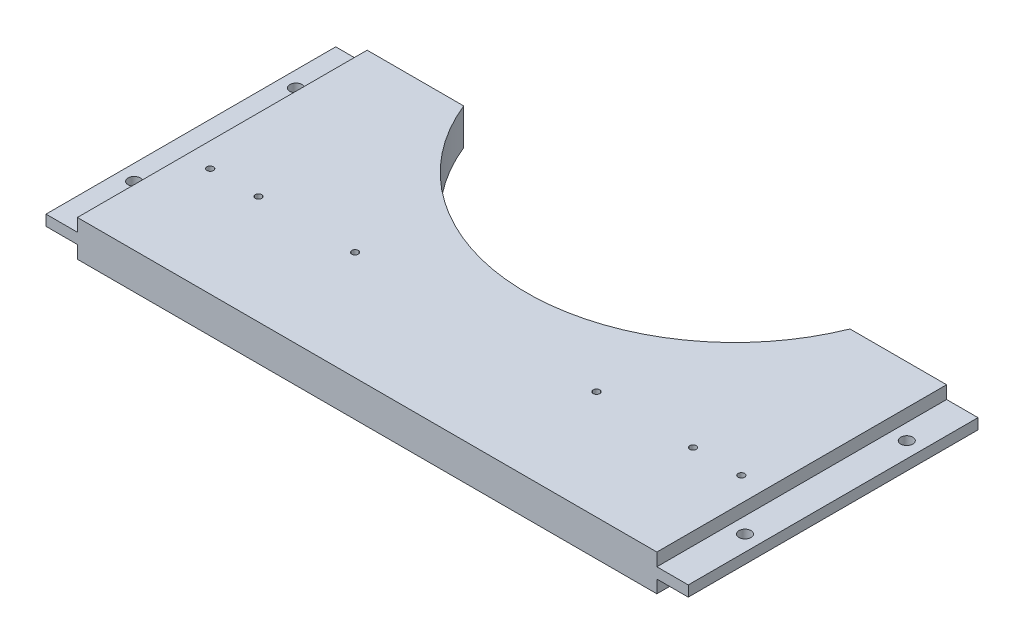
ISO-10303-21;
HEADER;
FILE_DESCRIPTION(('STEP AP214'),'2;1');
FILE_NAME('part.step','',(''),(''),'','','');
FILE_SCHEMA(('AUTOMOTIVE_DESIGN { 1 0 10303 214 1 1 1 1 }'));
ENDSEC;
DATA;
#1=APPLICATION_CONTEXT('core data for automotive mechanical design processes');
#2=APPLICATION_PROTOCOL_DEFINITION('international standard','automotive_design',2000,#1);
#3=PRODUCT_CONTEXT('',#1,'mechanical');
#4=PRODUCT('Part','Part','',(#3));
#5=PRODUCT_RELATED_PRODUCT_CATEGORY('part','',(#4));
#6=PRODUCT_DEFINITION_FORMATION('','',#4);
#7=PRODUCT_DEFINITION_CONTEXT('part definition',#1,'design');
#8=PRODUCT_DEFINITION('design','',#6,#7);
#9=PRODUCT_DEFINITION_SHAPE('','',#8);
#10=(LENGTH_UNIT() NAMED_UNIT(*) SI_UNIT(.MILLI.,.METRE.));
#11=(NAMED_UNIT(*) PLANE_ANGLE_UNIT() SI_UNIT($,.RADIAN.));
#12=(NAMED_UNIT(*) SI_UNIT($,.STERADIAN.) SOLID_ANGLE_UNIT());
#13=UNCERTAINTY_MEASURE_WITH_UNIT(LENGTH_MEASURE(1.E-05),#10,'distance_accuracy_value','');
#14=(GEOMETRIC_REPRESENTATION_CONTEXT(3) GLOBAL_UNCERTAINTY_ASSIGNED_CONTEXT((#13)) GLOBAL_UNIT_ASSIGNED_CONTEXT((#10,
#11,#12)) REPRESENTATION_CONTEXT('',''));
#15=CARTESIAN_POINT('',(0.,0.,0.));
#16=DIRECTION('',(0.,0.,1.));
#17=DIRECTION('',(1.,0.,0.));
#18=AXIS2_PLACEMENT_3D('',#15,#16,#17);
#19=CARTESIAN_POINT('',(152.4,9.525,0.));
#20=DIRECTION('',(-1.,0.,0.));
#21=DIRECTION('',(0.,0.,1.));
#22=AXIS2_PLACEMENT_3D('',#19,#20,#21);
#23=PLANE('',#22);
#24=DIRECTION('',(0.,0.,-1.));
#25=VECTOR('',#24,1.);
#26=CARTESIAN_POINT('',(152.4,-2.794,-76.2));
#27=LINE('',#26,#25);
#28=CARTESIAN_POINT('',(152.4,-2.794,76.2));
#29=VERTEX_POINT('',#28);
#30=CARTESIAN_POINT('',(152.4,-2.794,-76.2));
#31=VERTEX_POINT('',#30);
#32=EDGE_CURVE('E192',#29,#31,#27,.T.);
#33=ORIENTED_EDGE('',*,*,#32,.F.);
#34=DIRECTION('',(0.,-1.,0.));
#35=VECTOR('',#34,1.);
#36=CARTESIAN_POINT('',(152.4,9.525,76.2));
#37=LINE('',#36,#35);
#38=CARTESIAN_POINT('',(152.4,-9.525,76.2));
#39=VERTEX_POINT('',#38);
#40=EDGE_CURVE('E172',#29,#39,#37,.T.);
#41=ORIENTED_EDGE('',*,*,#40,.T.);
#42=DIRECTION('',(0.,0.,-1.));
#43=VECTOR('',#42,1.);
#44=CARTESIAN_POINT('',(152.4,-9.525,0.));
#45=LINE('',#44,#43);
#46=CARTESIAN_POINT('',(152.4,-9.525,-76.2));
#47=VERTEX_POINT('',#46);
#48=EDGE_CURVE('E343',#39,#47,#45,.T.);
#49=ORIENTED_EDGE('',*,*,#48,.T.);
#50=DIRECTION('',(0.,-1.,0.));
#51=VECTOR('',#50,1.);
#52=CARTESIAN_POINT('',(152.4,9.525,-76.2));
#53=LINE('',#52,#51);
#54=EDGE_CURVE('E365',#31,#47,#53,.T.);
#55=ORIENTED_EDGE('',*,*,#54,.F.);
#56=EDGE_LOOP('',(#33,#41,#49,#55));
#57=FACE_BOUND('',#56,.T.);
#58=ADVANCED_FACE('F43',(#57),#23,.F.);
#59=CARTESIAN_POINT('',(-152.4,9.525,0.));
#60=DIRECTION('',(1.,0.,0.));
#61=DIRECTION('',(0.,0.,-1.));
#62=AXIS2_PLACEMENT_3D('',#59,#60,#61);
#63=PLANE('',#62);
#64=DIRECTION('',(0.,0.,-1.));
#65=VECTOR('',#64,1.);
#66=CARTESIAN_POINT('',(-152.4,2.794,-76.2));
#67=LINE('',#66,#65);
#68=CARTESIAN_POINT('',(-152.4,2.794,76.2));
#69=VERTEX_POINT('',#68);
#70=CARTESIAN_POINT('',(-152.4,2.794,-76.2));
#71=VERTEX_POINT('',#70);
#72=EDGE_CURVE('E233',#69,#71,#67,.T.);
#73=ORIENTED_EDGE('',*,*,#72,.F.);
#74=DIRECTION('',(0.,-1.,0.));
#75=VECTOR('',#74,1.);
#76=CARTESIAN_POINT('',(-152.4,9.525,76.2));
#77=LINE('',#76,#75);
#78=CARTESIAN_POINT('',(-152.4,9.525,76.2));
#79=VERTEX_POINT('',#78);
#80=EDGE_CURVE('E11',#79,#69,#77,.T.);
#81=ORIENTED_EDGE('',*,*,#80,.F.);
#82=DIRECTION('',(0.,0.,1.));
#83=VECTOR('',#82,1.);
#84=CARTESIAN_POINT('',(-152.4,9.525,0.));
#85=LINE('',#84,#83);
#86=CARTESIAN_POINT('',(-152.4,9.525,-76.2));
#87=VERTEX_POINT('',#86);
#88=EDGE_CURVE('E316',#87,#79,#85,.T.);
#89=ORIENTED_EDGE('',*,*,#88,.F.);
#90=DIRECTION('',(0.,-1.,0.));
#91=VECTOR('',#90,1.);
#92=CARTESIAN_POINT('',(-152.4,9.525,-76.2));
#93=LINE('',#92,#91);
#94=EDGE_CURVE('E358',#87,#71,#93,.T.);
#95=ORIENTED_EDGE('',*,*,#94,.T.);
#96=EDGE_LOOP('',(#73,#81,#89,#95));
#97=FACE_BOUND('',#96,.T.);
#98=ADVANCED_FACE('F428',(#97),#63,.F.);
#99=CARTESIAN_POINT('',(-152.4,-2.794,76.2));
#100=VERTEX_POINT('',#99);
#101=CARTESIAN_POINT('',(-152.4,-9.525,76.2));
#102=VERTEX_POINT('',#101);
#103=EDGE_CURVE('E53',#100,#102,#77,.T.);
#104=ORIENTED_EDGE('',*,*,#103,.F.);
#105=DIRECTION('',(0.,0.,-1.));
#106=VECTOR('',#105,1.);
#107=CARTESIAN_POINT('',(-152.4,-2.794,-76.2));
#108=LINE('',#107,#106);
#109=CARTESIAN_POINT('',(-152.4,-2.794,-76.2));
#110=VERTEX_POINT('',#109);
#111=EDGE_CURVE('E69',#100,#110,#108,.T.);
#112=ORIENTED_EDGE('',*,*,#111,.T.);
#113=CARTESIAN_POINT('',(-152.4,-9.525,-76.2));
#114=VERTEX_POINT('',#113);
#115=EDGE_CURVE('E336',#110,#114,#93,.T.);
#116=ORIENTED_EDGE('',*,*,#115,.T.);
#117=DIRECTION('',(0.,0.,1.));
#118=VECTOR('',#117,1.);
#119=CARTESIAN_POINT('',(-152.4,-9.525,0.));
#120=LINE('',#119,#118);
#121=EDGE_CURVE('E315',#114,#102,#120,.T.);
#122=ORIENTED_EDGE('',*,*,#121,.T.);
#123=EDGE_LOOP('',(#104,#112,#116,#122));
#124=FACE_BOUND('',#123,.T.);
#125=ADVANCED_FACE('F45',(#124),#63,.F.);
#126=CARTESIAN_POINT('',(0.,9.525,76.2));
#127=DIRECTION('',(0.,0.,-1.));
#128=DIRECTION('',(-1.,0.,0.));
#129=AXIS2_PLACEMENT_3D('',#126,#127,#128);
#130=PLANE('',#129);
#131=DIRECTION('',(1.,0.,0.));
#132=VECTOR('',#131,1.);
#133=CARTESIAN_POINT('',(0.,-9.525,76.2));
#134=LINE('',#133,#132);
#135=EDGE_CURVE('E340',#102,#39,#134,.T.);
#136=ORIENTED_EDGE('',*,*,#135,.T.);
#137=ORIENTED_EDGE('',*,*,#40,.F.);
#138=DIRECTION('',(-1.,0.,0.));
#139=VECTOR('',#138,1.);
#140=CARTESIAN_POINT('',(152.4,-2.794,76.2));
#141=LINE('',#140,#139);
#142=CARTESIAN_POINT('',(168.91,-2.794,76.2));
#143=VERTEX_POINT('',#142);
#144=EDGE_CURVE('E198',#143,#29,#141,.T.);
#145=ORIENTED_EDGE('',*,*,#144,.F.);
#146=DIRECTION('',(0.,-1.,0.));
#147=VECTOR('',#146,1.);
#148=CARTESIAN_POINT('',(168.91,2.794,76.2));
#149=LINE('',#148,#147);
#150=CARTESIAN_POINT('',(168.91,2.794,76.2));
#151=VERTEX_POINT('',#150);
#152=EDGE_CURVE('E165',#151,#143,#149,.T.);
#153=ORIENTED_EDGE('',*,*,#152,.F.);
#154=DIRECTION('',(-1.,0.,0.));
#155=VECTOR('',#154,1.);
#156=CARTESIAN_POINT('',(152.4,2.794,76.2));
#157=LINE('',#156,#155);
#158=CARTESIAN_POINT('',(152.4,2.794,76.2));
#159=VERTEX_POINT('',#158);
#160=EDGE_CURVE('E149',#151,#159,#157,.T.);
#161=ORIENTED_EDGE('',*,*,#160,.T.);
#162=CARTESIAN_POINT('',(152.4,9.525,76.2));
#163=VERTEX_POINT('',#162);
#164=EDGE_CURVE('E162',#163,#159,#37,.T.);
#165=ORIENTED_EDGE('',*,*,#164,.F.);
#166=DIRECTION('',(1.,0.,0.));
#167=VECTOR('',#166,1.);
#168=CARTESIAN_POINT('',(0.,9.525,76.2));
#169=LINE('',#168,#167);
#170=EDGE_CURVE('E320',#79,#163,#169,.T.);
#171=ORIENTED_EDGE('',*,*,#170,.F.);
#172=ORIENTED_EDGE('',*,*,#80,.T.);
#173=DIRECTION('',(1.,0.,0.));
#174=VECTOR('',#173,1.);
#175=CARTESIAN_POINT('',(-152.4,2.794,76.2));
#176=LINE('',#175,#174);
#177=CARTESIAN_POINT('',(-168.91,2.794,76.2));
#178=VERTEX_POINT('',#177);
#179=EDGE_CURVE('E244',#178,#69,#176,.T.);
#180=ORIENTED_EDGE('',*,*,#179,.F.);
#181=DIRECTION('',(0.,-1.,0.));
#182=VECTOR('',#181,1.);
#183=CARTESIAN_POINT('',(-168.91,2.794,76.2));
#184=LINE('',#183,#182);
#185=CARTESIAN_POINT('',(-168.91,-2.794,76.2));
#186=VERTEX_POINT('',#185);
#187=EDGE_CURVE('E248',#178,#186,#184,.T.);
#188=ORIENTED_EDGE('',*,*,#187,.T.);
#189=DIRECTION('',(1.,0.,0.));
#190=VECTOR('',#189,1.);
#191=CARTESIAN_POINT('',(-152.4,-2.794,76.2));
#192=LINE('',#191,#190);
#193=EDGE_CURVE('E238',#186,#100,#192,.T.);
#194=ORIENTED_EDGE('',*,*,#193,.T.);
#195=ORIENTED_EDGE('',*,*,#103,.T.);
#196=EDGE_LOOP('',(#136,#137,#145,#153,#161,#165,#171,#172,#180,#188,#194,#195));
#197=FACE_BOUND('',#196,.T.);
#198=ADVANCED_FACE('F161',(#197),#130,.F.);
#199=ORIENTED_EDGE('',*,*,#164,.T.);
#200=DIRECTION('',(0.,0.,-1.));
#201=VECTOR('',#200,1.);
#202=CARTESIAN_POINT('',(152.4,2.794,-76.2));
#203=LINE('',#202,#201);
#204=CARTESIAN_POINT('',(152.4,2.794,-76.2));
#205=VERTEX_POINT('',#204);
#206=EDGE_CURVE('E146',#159,#205,#203,.T.);
#207=ORIENTED_EDGE('',*,*,#206,.T.);
#208=CARTESIAN_POINT('',(152.4,9.525,-76.2));
#209=VERTEX_POINT('',#208);
#210=EDGE_CURVE('E176',#209,#205,#53,.T.);
#211=ORIENTED_EDGE('',*,*,#210,.F.);
#212=DIRECTION('',(0.,0.,-1.));
#213=VECTOR('',#212,1.);
#214=CARTESIAN_POINT('',(152.4,9.525,0.));
#215=LINE('',#214,#213);
#216=EDGE_CURVE('E170',#163,#209,#215,.T.);
#217=ORIENTED_EDGE('',*,*,#216,.F.);
#218=EDGE_LOOP('',(#199,#207,#211,#217));
#219=FACE_BOUND('',#218,.T.);
#220=ADVANCED_FACE('F169',(#219),#23,.F.);
#221=CARTESIAN_POINT('',(0.,9.525,-76.2));
#222=DIRECTION('',(0.,0.,1.));
#223=DIRECTION('',(1.,0.,0.));
#224=AXIS2_PLACEMENT_3D('',#221,#222,#223);
#225=PLANE('',#224);
#226=DIRECTION('',(-1.,0.,0.));
#227=VECTOR('',#226,1.);
#228=CARTESIAN_POINT('',(0.,-9.525,-76.2));
#229=LINE('',#228,#227);
#230=CARTESIAN_POINT('',(101.6,-9.525,-76.2));
#231=VERTEX_POINT('',#230);
#232=EDGE_CURVE('E347',#47,#231,#229,.T.);
#233=ORIENTED_EDGE('',*,*,#232,.T.);
#234=DIRECTION('',(0.,-1.,0.));
#235=VECTOR('',#234,1.);
#236=CARTESIAN_POINT('',(101.6,9.525,-76.2));
#237=LINE('',#236,#235);
#238=CARTESIAN_POINT('',(101.6,9.525,-76.2));
#239=VERTEX_POINT('',#238);
#240=EDGE_CURVE('E363',#239,#231,#237,.T.);
#241=ORIENTED_EDGE('',*,*,#240,.F.);
#242=DIRECTION('',(-1.,0.,0.));
#243=VECTOR('',#242,1.);
#244=CARTESIAN_POINT('',(0.,9.525,-76.2));
#245=LINE('',#244,#243);
#246=EDGE_CURVE('E326',#209,#239,#245,.T.);
#247=ORIENTED_EDGE('',*,*,#246,.F.);
#248=ORIENTED_EDGE('',*,*,#210,.T.);
#249=DIRECTION('',(1.,0.,0.));
#250=VECTOR('',#249,1.);
#251=CARTESIAN_POINT('',(152.4,2.794,-76.2));
#252=LINE('',#251,#250);
#253=CARTESIAN_POINT('',(168.91,2.794,-76.2));
#254=VERTEX_POINT('',#253);
#255=EDGE_CURVE('E61',#205,#254,#252,.T.);
#256=ORIENTED_EDGE('',*,*,#255,.T.);
#257=DIRECTION('',(0.,-1.,0.));
#258=VECTOR('',#257,1.);
#259=CARTESIAN_POINT('',(168.91,2.794,-76.2));
#260=LINE('',#259,#258);
#261=CARTESIAN_POINT('',(168.91,-2.794,-76.2));
#262=VERTEX_POINT('',#261);
#263=EDGE_CURVE('E212',#254,#262,#260,.T.);
#264=ORIENTED_EDGE('',*,*,#263,.T.);
#265=DIRECTION('',(1.,0.,0.));
#266=VECTOR('',#265,1.);
#267=CARTESIAN_POINT('',(152.4,-2.794,-76.2));
#268=LINE('',#267,#266);
#269=EDGE_CURVE('E156',#31,#262,#268,.T.);
#270=ORIENTED_EDGE('',*,*,#269,.F.);
#271=ORIENTED_EDGE('',*,*,#54,.T.);
#272=EDGE_LOOP('',(#233,#241,#247,#248,#256,#264,#270,#271));
#273=FACE_BOUND('',#272,.T.);
#274=ADVANCED_FACE('F375',(#273),#225,.F.);
#275=CARTESIAN_POINT('',(0.,9.525,-117.169259259259));
#276=DIRECTION('',(0.,-1.,0.));
#277=DIRECTION('',(0.,0.,-1.));
#278=AXIS2_PLACEMENT_3D('',#275,#276,#277);
#279=CYLINDRICAL_SURFACE('',#278,109.549259259259);
#280=CARTESIAN_POINT('',(0.,-9.525,-117.169259259259));
#281=DIRECTION('',(0.,1.,0.));
#282=DIRECTION('',(0.,0.,1.));
#283=AXIS2_PLACEMENT_3D('',#280,#281,#282);
#284=CIRCLE('',#283,109.549259259259);
#285=CARTESIAN_POINT('',(-101.6,-9.525,-76.2));
#286=VERTEX_POINT('',#285);
#287=EDGE_CURVE('E351',#286,#231,#284,.T.);
#288=ORIENTED_EDGE('',*,*,#287,.F.);
#289=DIRECTION('',(0.,-1.,0.));
#290=VECTOR('',#289,1.);
#291=CARTESIAN_POINT('',(-101.6,9.525,-76.2));
#292=LINE('',#291,#290);
#293=CARTESIAN_POINT('',(-101.6,9.525,-76.2));
#294=VERTEX_POINT('',#293);
#295=EDGE_CURVE('E361',#294,#286,#292,.T.);
#296=ORIENTED_EDGE('',*,*,#295,.F.);
#297=CARTESIAN_POINT('',(0.,9.525,-117.169259259259));
#298=DIRECTION('',(0.,1.,0.));
#299=DIRECTION('',(0.,0.,1.));
#300=AXIS2_PLACEMENT_3D('',#297,#298,#299);
#301=CIRCLE('',#300,109.549259259259);
#302=EDGE_CURVE('E329',#294,#239,#301,.T.);
#303=ORIENTED_EDGE('',*,*,#302,.T.);
#304=ORIENTED_EDGE('',*,*,#240,.T.);
#305=EDGE_LOOP('',(#288,#296,#303,#304));
#306=FACE_BOUND('',#305,.T.);
#307=ADVANCED_FACE('F441',(#306),#279,.F.);
#308=CARTESIAN_POINT('',(0.,9.525,-76.2));
#309=DIRECTION('',(0.,0.,1.));
#310=DIRECTION('',(1.,0.,0.));
#311=AXIS2_PLACEMENT_3D('',#308,#309,#310);
#312=PLANE('',#311);
#313=DIRECTION('',(-1.,0.,0.));
#314=VECTOR('',#313,1.);
#315=CARTESIAN_POINT('',(0.,-9.525,-76.2));
#316=LINE('',#315,#314);
#317=EDGE_CURVE('E321',#286,#114,#316,.T.);
#318=ORIENTED_EDGE('',*,*,#317,.T.);
#319=ORIENTED_EDGE('',*,*,#115,.F.);
#320=DIRECTION('',(-1.,0.,0.));
#321=VECTOR('',#320,1.);
#322=CARTESIAN_POINT('',(-152.4,-2.794,-76.2));
#323=LINE('',#322,#321);
#324=CARTESIAN_POINT('',(-168.91,-2.794,-76.2));
#325=VERTEX_POINT('',#324);
#326=EDGE_CURVE('E251',#110,#325,#323,.T.);
#327=ORIENTED_EDGE('',*,*,#326,.T.);
#328=DIRECTION('',(0.,-1.,0.));
#329=VECTOR('',#328,1.);
#330=CARTESIAN_POINT('',(-168.91,2.794,-76.2));
#331=LINE('',#330,#329);
#332=CARTESIAN_POINT('',(-168.91,2.794,-76.2));
#333=VERTEX_POINT('',#332);
#334=EDGE_CURVE('E263',#333,#325,#331,.T.);
#335=ORIENTED_EDGE('',*,*,#334,.F.);
#336=DIRECTION('',(-1.,0.,0.));
#337=VECTOR('',#336,1.);
#338=CARTESIAN_POINT('',(-152.4,2.794,-76.2));
#339=LINE('',#338,#337);
#340=EDGE_CURVE('E237',#71,#333,#339,.T.);
#341=ORIENTED_EDGE('',*,*,#340,.F.);
#342=ORIENTED_EDGE('',*,*,#94,.F.);
#343=DIRECTION('',(-1.,0.,0.));
#344=VECTOR('',#343,1.);
#345=CARTESIAN_POINT('',(0.,9.525,-76.2));
#346=LINE('',#345,#344);
#347=EDGE_CURVE('E333',#294,#87,#346,.T.);
#348=ORIENTED_EDGE('',*,*,#347,.F.);
#349=ORIENTED_EDGE('',*,*,#295,.T.);
#350=EDGE_LOOP('',(#318,#319,#327,#335,#341,#342,#348,#349));
#351=FACE_BOUND('',#350,.T.);
#352=ADVANCED_FACE('F397',(#351),#312,.F.);
#353=CARTESIAN_POINT('',(0.,9.525,0.));
#354=DIRECTION('',(0.,1.,0.));
#355=DIRECTION('',(0.,0.,1.));
#356=AXIS2_PLACEMENT_3D('',#353,#354,#355);
#357=PLANE('',#356);
#358=CARTESIAN_POINT('',(139.7,9.525,19.05));
#359=DIRECTION('',(0.,1.,0.));
#360=DIRECTION('',(0.,0.,1.));
#361=AXIS2_PLACEMENT_3D('',#358,#359,#360);
#362=CIRCLE('',#361,1.72719999999998);
#363=CARTESIAN_POINT('',(139.7,9.525,20.7772));
#364=VERTEX_POINT('',#363);
#365=EDGE_CURVE('E267',#364,#364,#362,.T.);
#366=ORIENTED_EDGE('',*,*,#365,.F.);
#367=EDGE_LOOP('',(#366));
#368=FACE_BOUND('',#367,.T.);
#369=CARTESIAN_POINT('',(114.3,9.525,19.05));
#370=DIRECTION('',(0.,1.,0.));
#371=DIRECTION('',(0.,0.,1.));
#372=AXIS2_PLACEMENT_3D('',#369,#370,#371);
#373=CIRCLE('',#372,1.7272);
#374=CARTESIAN_POINT('',(114.3,9.525,20.7772));
#375=VERTEX_POINT('',#374);
#376=EDGE_CURVE('E275',#375,#375,#373,.T.);
#377=ORIENTED_EDGE('',*,*,#376,.F.);
#378=EDGE_LOOP('',(#377));
#379=FACE_BOUND('',#378,.T.);
#380=CARTESIAN_POINT('',(63.5,9.525,19.05));
#381=DIRECTION('',(0.,1.,0.));
#382=DIRECTION('',(0.,0.,1.));
#383=AXIS2_PLACEMENT_3D('',#380,#381,#382);
#384=CIRCLE('',#383,1.7272);
#385=CARTESIAN_POINT('',(63.5,9.525,20.7772));
#386=VERTEX_POINT('',#385);
#387=EDGE_CURVE('E283',#386,#386,#384,.T.);
#388=ORIENTED_EDGE('',*,*,#387,.F.);
#389=EDGE_LOOP('',(#388));
#390=FACE_BOUND('',#389,.T.);
#391=CARTESIAN_POINT('',(-139.7,9.525,19.05));
#392=DIRECTION('',(0.,1.,0.));
#393=DIRECTION('',(0.,0.,1.));
#394=AXIS2_PLACEMENT_3D('',#391,#392,#393);
#395=CIRCLE('',#394,1.72719999999998);
#396=CARTESIAN_POINT('',(-139.7,9.525,20.7772));
#397=VERTEX_POINT('',#396);
#398=EDGE_CURVE('E291',#397,#397,#395,.T.);
#399=ORIENTED_EDGE('',*,*,#398,.F.);
#400=EDGE_LOOP('',(#399));
#401=FACE_BOUND('',#400,.T.);
#402=CARTESIAN_POINT('',(-114.3,9.525,19.05));
#403=DIRECTION('',(0.,1.,0.));
#404=DIRECTION('',(0.,0.,1.));
#405=AXIS2_PLACEMENT_3D('',#402,#403,#404);
#406=CIRCLE('',#405,1.7272);
#407=CARTESIAN_POINT('',(-114.3,9.525,20.7772));
#408=VERTEX_POINT('',#407);
#409=EDGE_CURVE('E299',#408,#408,#406,.T.);
#410=ORIENTED_EDGE('',*,*,#409,.F.);
#411=EDGE_LOOP('',(#410));
#412=FACE_BOUND('',#411,.T.);
#413=CARTESIAN_POINT('',(-63.5,9.525,19.05));
#414=DIRECTION('',(0.,1.,0.));
#415=DIRECTION('',(0.,0.,1.));
#416=AXIS2_PLACEMENT_3D('',#413,#414,#415);
#417=CIRCLE('',#416,1.7272);
#418=CARTESIAN_POINT('',(-63.5,9.525,20.7772));
#419=VERTEX_POINT('',#418);
#420=EDGE_CURVE('E307',#419,#419,#417,.T.);
#421=ORIENTED_EDGE('',*,*,#420,.F.);
#422=EDGE_LOOP('',(#421));
#423=FACE_BOUND('',#422,.T.);
#424=ORIENTED_EDGE('',*,*,#88,.T.);
#425=ORIENTED_EDGE('',*,*,#170,.T.);
#426=ORIENTED_EDGE('',*,*,#216,.T.);
#427=ORIENTED_EDGE('',*,*,#246,.T.);
#428=ORIENTED_EDGE('',*,*,#302,.F.);
#429=ORIENTED_EDGE('',*,*,#347,.T.);
#430=EDGE_LOOP('',(#424,#425,#426,#427,#428,#429));
#431=FACE_BOUND('',#430,.T.);
#432=ADVANCED_FACE('F378',(#368,#379,#390,#401,#412,#423,#431),#357,.T.);
#433=CARTESIAN_POINT('',(0.,-9.525,0.));
#434=DIRECTION('',(0.,1.,0.));
#435=DIRECTION('',(0.,0.,1.));
#436=AXIS2_PLACEMENT_3D('',#433,#434,#435);
#437=PLANE('',#436);
#438=CARTESIAN_POINT('',(139.7,-9.525,19.05));
#439=DIRECTION('',(0.,1.,0.));
#440=DIRECTION('',(0.,0.,1.));
#441=AXIS2_PLACEMENT_3D('',#438,#439,#440);
#442=CIRCLE('',#441,1.72719999999998);
#443=CARTESIAN_POINT('',(139.7,-9.525,20.7772));
#444=VERTEX_POINT('',#443);
#445=EDGE_CURVE('E271',#444,#444,#442,.T.);
#446=ORIENTED_EDGE('',*,*,#445,.T.);
#447=EDGE_LOOP('',(#446));
#448=FACE_BOUND('',#447,.T.);
#449=CARTESIAN_POINT('',(114.3,-9.525,19.05));
#450=DIRECTION('',(0.,1.,0.));
#451=DIRECTION('',(0.,0.,1.));
#452=AXIS2_PLACEMENT_3D('',#449,#450,#451);
#453=CIRCLE('',#452,1.7272);
#454=CARTESIAN_POINT('',(114.3,-9.525,20.7772));
#455=VERTEX_POINT('',#454);
#456=EDGE_CURVE('E279',#455,#455,#453,.T.);
#457=ORIENTED_EDGE('',*,*,#456,.T.);
#458=EDGE_LOOP('',(#457));
#459=FACE_BOUND('',#458,.T.);
#460=CARTESIAN_POINT('',(63.5,-9.525,19.05));
#461=DIRECTION('',(0.,1.,0.));
#462=DIRECTION('',(0.,0.,1.));
#463=AXIS2_PLACEMENT_3D('',#460,#461,#462);
#464=CIRCLE('',#463,1.7272);
#465=CARTESIAN_POINT('',(63.5,-9.525,20.7772));
#466=VERTEX_POINT('',#465);
#467=EDGE_CURVE('E287',#466,#466,#464,.T.);
#468=ORIENTED_EDGE('',*,*,#467,.T.);
#469=EDGE_LOOP('',(#468));
#470=FACE_BOUND('',#469,.T.);
#471=CARTESIAN_POINT('',(-139.7,-9.525,19.05));
#472=DIRECTION('',(0.,1.,0.));
#473=DIRECTION('',(0.,0.,1.));
#474=AXIS2_PLACEMENT_3D('',#471,#472,#473);
#475=CIRCLE('',#474,1.72719999999998);
#476=CARTESIAN_POINT('',(-139.7,-9.525,20.7772));
#477=VERTEX_POINT('',#476);
#478=EDGE_CURVE('E295',#477,#477,#475,.T.);
#479=ORIENTED_EDGE('',*,*,#478,.T.);
#480=EDGE_LOOP('',(#479));
#481=FACE_BOUND('',#480,.T.);
#482=CARTESIAN_POINT('',(-114.3,-9.525,19.05));
#483=DIRECTION('',(0.,1.,0.));
#484=DIRECTION('',(0.,0.,1.));
#485=AXIS2_PLACEMENT_3D('',#482,#483,#484);
#486=CIRCLE('',#485,1.7272);
#487=CARTESIAN_POINT('',(-114.3,-9.525,20.7772));
#488=VERTEX_POINT('',#487);
#489=EDGE_CURVE('E303',#488,#488,#486,.T.);
#490=ORIENTED_EDGE('',*,*,#489,.T.);
#491=EDGE_LOOP('',(#490));
#492=FACE_BOUND('',#491,.T.);
#493=CARTESIAN_POINT('',(-63.5,-9.525,19.05));
#494=DIRECTION('',(0.,1.,0.));
#495=DIRECTION('',(0.,0.,1.));
#496=AXIS2_PLACEMENT_3D('',#493,#494,#495);
#497=CIRCLE('',#496,1.7272);
#498=CARTESIAN_POINT('',(-63.5,-9.525,20.7772));
#499=VERTEX_POINT('',#498);
#500=EDGE_CURVE('E311',#499,#499,#497,.T.);
#501=ORIENTED_EDGE('',*,*,#500,.T.);
#502=EDGE_LOOP('',(#501));
#503=FACE_BOUND('',#502,.T.);
#504=ORIENTED_EDGE('',*,*,#121,.F.);
#505=ORIENTED_EDGE('',*,*,#317,.F.);
#506=ORIENTED_EDGE('',*,*,#287,.T.);
#507=ORIENTED_EDGE('',*,*,#232,.F.);
#508=ORIENTED_EDGE('',*,*,#48,.F.);
#509=ORIENTED_EDGE('',*,*,#135,.F.);
#510=EDGE_LOOP('',(#504,#505,#506,#507,#508,#509));
#511=FACE_BOUND('',#510,.T.);
#512=ADVANCED_FACE('F403',(#448,#459,#470,#481,#492,#503,#511),#437,.F.);
#513=CARTESIAN_POINT('',(-63.5,9.525,19.05));
#514=DIRECTION('',(0.,1.,0.));
#515=DIRECTION('',(0.,0.,1.));
#516=AXIS2_PLACEMENT_3D('',#513,#514,#515);
#517=CYLINDRICAL_SURFACE('',#516,1.7272);
#518=ORIENTED_EDGE('',*,*,#500,.F.);
#519=EDGE_LOOP('',(#518));
#520=FACE_BOUND('',#519,.T.);
#521=ORIENTED_EDGE('',*,*,#420,.T.);
#522=EDGE_LOOP('',(#521));
#523=FACE_BOUND('',#522,.T.);
#524=ADVANCED_FACE('F604',(#520,#523),#517,.F.);
#525=CARTESIAN_POINT('',(-114.3,9.525,19.05));
#526=DIRECTION('',(0.,1.,0.));
#527=DIRECTION('',(0.,0.,1.));
#528=AXIS2_PLACEMENT_3D('',#525,#526,#527);
#529=CYLINDRICAL_SURFACE('',#528,1.7272);
#530=ORIENTED_EDGE('',*,*,#489,.F.);
#531=EDGE_LOOP('',(#530));
#532=FACE_BOUND('',#531,.T.);
#533=ORIENTED_EDGE('',*,*,#409,.T.);
#534=EDGE_LOOP('',(#533));
#535=FACE_BOUND('',#534,.T.);
#536=ADVANCED_FACE('F621',(#532,#535),#529,.F.);
#537=CARTESIAN_POINT('',(-139.7,9.525,19.05));
#538=DIRECTION('',(0.,1.,0.));
#539=DIRECTION('',(0.,0.,1.));
#540=AXIS2_PLACEMENT_3D('',#537,#538,#539);
#541=CYLINDRICAL_SURFACE('',#540,1.72719999999998);
#542=ORIENTED_EDGE('',*,*,#478,.F.);
#543=EDGE_LOOP('',(#542));
#544=FACE_BOUND('',#543,.T.);
#545=ORIENTED_EDGE('',*,*,#398,.T.);
#546=EDGE_LOOP('',(#545));
#547=FACE_BOUND('',#546,.T.);
#548=ADVANCED_FACE('F631',(#544,#547),#541,.F.);
#549=CARTESIAN_POINT('',(63.5,9.525,19.05));
#550=DIRECTION('',(0.,1.,0.));
#551=DIRECTION('',(0.,0.,1.));
#552=AXIS2_PLACEMENT_3D('',#549,#550,#551);
#553=CYLINDRICAL_SURFACE('',#552,1.7272);
#554=ORIENTED_EDGE('',*,*,#467,.F.);
#555=EDGE_LOOP('',(#554));
#556=FACE_BOUND('',#555,.T.);
#557=ORIENTED_EDGE('',*,*,#387,.T.);
#558=EDGE_LOOP('',(#557));
#559=FACE_BOUND('',#558,.T.);
#560=ADVANCED_FACE('F641',(#556,#559),#553,.F.);
#561=CARTESIAN_POINT('',(114.3,9.525,19.05));
#562=DIRECTION('',(0.,1.,0.));
#563=DIRECTION('',(0.,0.,1.));
#564=AXIS2_PLACEMENT_3D('',#561,#562,#563);
#565=CYLINDRICAL_SURFACE('',#564,1.7272);
#566=ORIENTED_EDGE('',*,*,#456,.F.);
#567=EDGE_LOOP('',(#566));
#568=FACE_BOUND('',#567,.T.);
#569=ORIENTED_EDGE('',*,*,#376,.T.);
#570=EDGE_LOOP('',(#569));
#571=FACE_BOUND('',#570,.T.);
#572=ADVANCED_FACE('F651',(#568,#571),#565,.F.);
#573=CARTESIAN_POINT('',(139.7,9.525,19.05));
#574=DIRECTION('',(0.,1.,0.));
#575=DIRECTION('',(0.,0.,1.));
#576=AXIS2_PLACEMENT_3D('',#573,#574,#575);
#577=CYLINDRICAL_SURFACE('',#576,1.72719999999998);
#578=ORIENTED_EDGE('',*,*,#445,.F.);
#579=EDGE_LOOP('',(#578));
#580=FACE_BOUND('',#579,.T.);
#581=ORIENTED_EDGE('',*,*,#365,.T.);
#582=EDGE_LOOP('',(#581));
#583=FACE_BOUND('',#582,.T.);
#584=ADVANCED_FACE('F468',(#580,#583),#577,.F.);
#585=CARTESIAN_POINT('',(-168.91,2.794,-76.2));
#586=DIRECTION('',(1.,0.,0.));
#587=DIRECTION('',(0.,0.,-1.));
#588=AXIS2_PLACEMENT_3D('',#585,#586,#587);
#589=PLANE('',#588);
#590=DIRECTION('',(0.,0.,1.));
#591=VECTOR('',#590,1.);
#592=CARTESIAN_POINT('',(-168.91,-2.794,-76.2));
#593=LINE('',#592,#591);
#594=EDGE_CURVE('E254',#325,#186,#593,.T.);
#595=ORIENTED_EDGE('',*,*,#594,.T.);
#596=ORIENTED_EDGE('',*,*,#187,.F.);
#597=DIRECTION('',(0.,0.,1.));
#598=VECTOR('',#597,1.);
#599=CARTESIAN_POINT('',(-168.91,2.794,-76.2));
#600=LINE('',#599,#598);
#601=EDGE_CURVE('E241',#333,#178,#600,.T.);
#602=ORIENTED_EDGE('',*,*,#601,.F.);
#603=ORIENTED_EDGE('',*,*,#334,.T.);
#604=EDGE_LOOP('',(#595,#596,#602,#603));
#605=FACE_BOUND('',#604,.T.);
#606=ADVANCED_FACE('F390',(#605),#589,.F.);
#607=CARTESIAN_POINT('',(0.,2.794,0.));
#608=DIRECTION('',(0.,-1.,0.));
#609=DIRECTION('',(0.,0.,-1.));
#610=AXIS2_PLACEMENT_3D('',#607,#608,#609);
#611=PLANE('',#610);
#612=CARTESIAN_POINT('',(-160.655,2.794,-46.99));
#613=DIRECTION('',(0.,1.,0.));
#614=DIRECTION('',(0.,0.,1.));
#615=AXIS2_PLACEMENT_3D('',#612,#613,#614);
#616=CIRCLE('',#615,3.17500000000001);
#617=CARTESIAN_POINT('',(-160.655,2.794,-43.815));
#618=VERTEX_POINT('',#617);
#619=EDGE_CURVE('E188',#618,#618,#616,.T.);
#620=ORIENTED_EDGE('',*,*,#619,.F.);
#621=EDGE_LOOP('',(#620));
#622=FACE_BOUND('',#621,.T.);
#623=CARTESIAN_POINT('',(-160.655,2.794,38.1));
#624=DIRECTION('',(0.,1.,0.));
#625=DIRECTION('',(0.,0.,1.));
#626=AXIS2_PLACEMENT_3D('',#623,#624,#625);
#627=CIRCLE('',#626,3.17500000000001);
#628=CARTESIAN_POINT('',(-160.655,2.794,41.275));
#629=VERTEX_POINT('',#628);
#630=EDGE_CURVE('E184',#629,#629,#627,.T.);
#631=ORIENTED_EDGE('',*,*,#630,.F.);
#632=EDGE_LOOP('',(#631));
#633=FACE_BOUND('',#632,.T.);
#634=ORIENTED_EDGE('',*,*,#72,.T.);
#635=ORIENTED_EDGE('',*,*,#340,.T.);
#636=ORIENTED_EDGE('',*,*,#601,.T.);
#637=ORIENTED_EDGE('',*,*,#179,.T.);
#638=EDGE_LOOP('',(#634,#635,#636,#637));
#639=FACE_BOUND('',#638,.T.);
#640=ADVANCED_FACE('F384',(#622,#633,#639),#611,.F.);
#641=CARTESIAN_POINT('',(0.,-2.794,0.));
#642=DIRECTION('',(0.,-1.,0.));
#643=DIRECTION('',(0.,0.,-1.));
#644=AXIS2_PLACEMENT_3D('',#641,#642,#643);
#645=PLANE('',#644);
#646=CARTESIAN_POINT('',(-160.655,-2.794,-46.99));
#647=DIRECTION('',(0.,-1.,0.));
#648=DIRECTION('',(0.,0.,-1.));
#649=AXIS2_PLACEMENT_3D('',#646,#647,#648);
#650=CIRCLE('',#649,3.175);
#651=CARTESIAN_POINT('',(-160.655,-2.794,-50.165));
#652=VERTEX_POINT('',#651);
#653=EDGE_CURVE('E185',#652,#652,#650,.T.);
#654=ORIENTED_EDGE('',*,*,#653,.F.);
#655=EDGE_LOOP('',(#654));
#656=FACE_BOUND('',#655,.T.);
#657=CARTESIAN_POINT('',(-160.655,-2.794,38.1));
#658=DIRECTION('',(0.,-1.,0.));
#659=DIRECTION('',(0.,0.,-1.));
#660=AXIS2_PLACEMENT_3D('',#657,#658,#659);
#661=CIRCLE('',#660,3.175);
#662=CARTESIAN_POINT('',(-160.655,-2.794,34.925));
#663=VERTEX_POINT('',#662);
#664=EDGE_CURVE('E180',#663,#663,#661,.T.);
#665=ORIENTED_EDGE('',*,*,#664,.F.);
#666=EDGE_LOOP('',(#665));
#667=FACE_BOUND('',#666,.T.);
#668=ORIENTED_EDGE('',*,*,#111,.F.);
#669=ORIENTED_EDGE('',*,*,#193,.F.);
#670=ORIENTED_EDGE('',*,*,#594,.F.);
#671=ORIENTED_EDGE('',*,*,#326,.F.);
#672=EDGE_LOOP('',(#668,#669,#670,#671));
#673=FACE_BOUND('',#672,.T.);
#674=ADVANCED_FACE('F394',(#656,#667,#673),#645,.T.);
#675=CARTESIAN_POINT('',(-160.655,2.794,38.1));
#676=DIRECTION('',(0.,1.,0.));
#677=DIRECTION('',(0.,0.,1.));
#678=AXIS2_PLACEMENT_3D('',#675,#676,#677);
#679=CYLINDRICAL_SURFACE('',#678,3.175);
#680=ORIENTED_EDGE('',*,*,#664,.T.);
#681=EDGE_LOOP('',(#680));
#682=FACE_BOUND('',#681,.T.);
#683=ORIENTED_EDGE('',*,*,#630,.T.);
#684=EDGE_LOOP('',(#683));
#685=FACE_BOUND('',#684,.T.);
#686=ADVANCED_FACE('F423',(#682,#685),#679,.F.);
#687=CARTESIAN_POINT('',(-160.655,2.794,-46.99));
#688=DIRECTION('',(0.,1.,0.));
#689=DIRECTION('',(0.,0.,1.));
#690=AXIS2_PLACEMENT_3D('',#687,#688,#689);
#691=CYLINDRICAL_SURFACE('',#690,3.175);
#692=ORIENTED_EDGE('',*,*,#653,.T.);
#693=EDGE_LOOP('',(#692));
#694=FACE_BOUND('',#693,.T.);
#695=ORIENTED_EDGE('',*,*,#619,.T.);
#696=EDGE_LOOP('',(#695));
#697=FACE_BOUND('',#696,.T.);
#698=ADVANCED_FACE('F415',(#694,#697),#691,.F.);
#699=CARTESIAN_POINT('',(168.91,2.794,-76.2));
#700=DIRECTION('',(1.,0.,0.));
#701=DIRECTION('',(0.,0.,-1.));
#702=AXIS2_PLACEMENT_3D('',#699,#700,#701);
#703=PLANE('',#702);
#704=DIRECTION('',(0.,0.,1.));
#705=VECTOR('',#704,1.);
#706=CARTESIAN_POINT('',(168.91,-2.794,-76.2));
#707=LINE('',#706,#705);
#708=EDGE_CURVE('E216',#262,#143,#707,.T.);
#709=ORIENTED_EDGE('',*,*,#708,.F.);
#710=ORIENTED_EDGE('',*,*,#263,.F.);
#711=DIRECTION('',(0.,0.,1.));
#712=VECTOR('',#711,1.);
#713=CARTESIAN_POINT('',(168.91,2.794,-76.2));
#714=LINE('',#713,#712);
#715=EDGE_CURVE('E167',#254,#151,#714,.T.);
#716=ORIENTED_EDGE('',*,*,#715,.T.);
#717=ORIENTED_EDGE('',*,*,#152,.T.);
#718=EDGE_LOOP('',(#709,#710,#716,#717));
#719=FACE_BOUND('',#718,.T.);
#720=ADVANCED_FACE('F413',(#719),#703,.T.);
#721=CARTESIAN_POINT('',(0.,2.794,0.));
#722=DIRECTION('',(0.,-1.,0.));
#723=DIRECTION('',(0.,0.,-1.));
#724=AXIS2_PLACEMENT_3D('',#721,#722,#723);
#725=PLANE('',#724);
#726=CARTESIAN_POINT('',(160.655,2.794,-46.99));
#727=DIRECTION('',(0.,1.,0.));
#728=DIRECTION('',(0.,0.,1.));
#729=AXIS2_PLACEMENT_3D('',#726,#727,#728);
#730=CIRCLE('',#729,3.17500000000001);
#731=CARTESIAN_POINT('',(160.655,2.794,-43.815));
#732=VERTEX_POINT('',#731);
#733=EDGE_CURVE('E206',#732,#732,#730,.T.);
#734=ORIENTED_EDGE('',*,*,#733,.F.);
#735=EDGE_LOOP('',(#734));
#736=FACE_BOUND('',#735,.T.);
#737=CARTESIAN_POINT('',(160.655,2.794,38.1));
#738=DIRECTION('',(0.,1.,0.));
#739=DIRECTION('',(0.,0.,1.));
#740=AXIS2_PLACEMENT_3D('',#737,#738,#739);
#741=CIRCLE('',#740,3.17500000000001);
#742=CARTESIAN_POINT('',(160.655,2.794,41.275));
#743=VERTEX_POINT('',#742);
#744=EDGE_CURVE('E193',#743,#743,#741,.T.);
#745=ORIENTED_EDGE('',*,*,#744,.F.);
#746=EDGE_LOOP('',(#745));
#747=FACE_BOUND('',#746,.T.);
#748=ORIENTED_EDGE('',*,*,#206,.F.);
#749=ORIENTED_EDGE('',*,*,#160,.F.);
#750=ORIENTED_EDGE('',*,*,#715,.F.);
#751=ORIENTED_EDGE('',*,*,#255,.F.);
#752=EDGE_LOOP('',(#748,#749,#750,#751));
#753=FACE_BOUND('',#752,.T.);
#754=ADVANCED_FACE('F148',(#736,#747,#753),#725,.F.);
#755=CARTESIAN_POINT('',(0.,-2.794,0.));
#756=DIRECTION('',(0.,-1.,0.));
#757=DIRECTION('',(0.,0.,-1.));
#758=AXIS2_PLACEMENT_3D('',#755,#756,#757);
#759=PLANE('',#758);
#760=CARTESIAN_POINT('',(160.655,-2.794,-46.99));
#761=DIRECTION('',(0.,-1.,0.));
#762=DIRECTION('',(0.,0.,-1.));
#763=AXIS2_PLACEMENT_3D('',#760,#761,#762);
#764=CIRCLE('',#763,3.175);
#765=CARTESIAN_POINT('',(160.655,-2.794,-50.165));
#766=VERTEX_POINT('',#765);
#767=EDGE_CURVE('E47',#766,#766,#764,.T.);
#768=ORIENTED_EDGE('',*,*,#767,.F.);
#769=EDGE_LOOP('',(#768));
#770=FACE_BOUND('',#769,.T.);
#771=CARTESIAN_POINT('',(160.655,-2.794,38.1));
#772=DIRECTION('',(0.,-1.,0.));
#773=DIRECTION('',(0.,0.,-1.));
#774=AXIS2_PLACEMENT_3D('',#771,#772,#773);
#775=CIRCLE('',#774,3.175);
#776=CARTESIAN_POINT('',(160.655,-2.794,34.925));
#777=VERTEX_POINT('',#776);
#778=EDGE_CURVE('E189',#777,#777,#775,.T.);
#779=ORIENTED_EDGE('',*,*,#778,.F.);
#780=EDGE_LOOP('',(#779));
#781=FACE_BOUND('',#780,.T.);
#782=ORIENTED_EDGE('',*,*,#32,.T.);
#783=ORIENTED_EDGE('',*,*,#269,.T.);
#784=ORIENTED_EDGE('',*,*,#708,.T.);
#785=ORIENTED_EDGE('',*,*,#144,.T.);
#786=EDGE_LOOP('',(#782,#783,#784,#785));
#787=FACE_BOUND('',#786,.T.);
#788=ADVANCED_FACE('F410',(#770,#781,#787),#759,.T.);
#789=CARTESIAN_POINT('',(160.655,2.794,38.1));
#790=DIRECTION('',(0.,1.,0.));
#791=DIRECTION('',(0.,0.,1.));
#792=AXIS2_PLACEMENT_3D('',#789,#790,#791);
#793=CYLINDRICAL_SURFACE('',#792,3.175);
#794=ORIENTED_EDGE('',*,*,#778,.T.);
#795=EDGE_LOOP('',(#794));
#796=FACE_BOUND('',#795,.T.);
#797=ORIENTED_EDGE('',*,*,#744,.T.);
#798=EDGE_LOOP('',(#797));
#799=FACE_BOUND('',#798,.T.);
#800=ADVANCED_FACE('F541',(#796,#799),#793,.F.);
#801=CARTESIAN_POINT('',(160.655,2.794,-46.99));
#802=DIRECTION('',(0.,1.,0.));
#803=DIRECTION('',(0.,0.,1.));
#804=AXIS2_PLACEMENT_3D('',#801,#802,#803);
#805=CYLINDRICAL_SURFACE('',#804,3.175);
#806=ORIENTED_EDGE('',*,*,#767,.T.);
#807=EDGE_LOOP('',(#806));
#808=FACE_BOUND('',#807,.T.);
#809=ORIENTED_EDGE('',*,*,#733,.T.);
#810=EDGE_LOOP('',(#809));
#811=FACE_BOUND('',#810,.T.);
#812=ADVANCED_FACE('F549',(#808,#811),#805,.F.);
#813=CLOSED_SHELL('',(#58,#98,#125,#198,#220,#274,#307,#352,#432,#512,#524,#536,#548,#560,#572,
#584,#606,#640,#674,#686,#698,#720,#754,#788,#800,#812));
#814=MANIFOLD_SOLID_BREP('B2',#813);
#815=ADVANCED_BREP_SHAPE_REPRESENTATION('',(#18,#814),#14);
#816=SHAPE_DEFINITION_REPRESENTATION(#9,#815);
ENDSEC;
END-ISO-10303-21;
